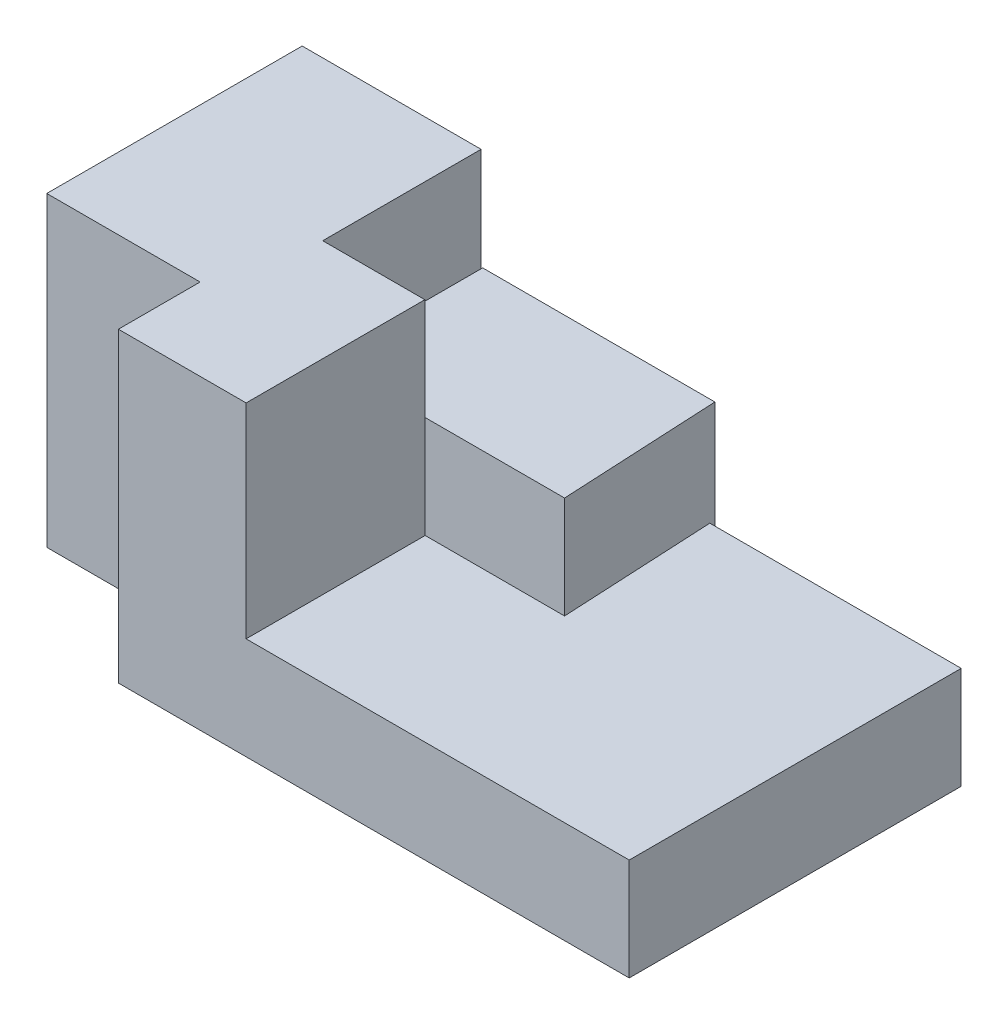
ISO-10303-21;
HEADER;
FILE_DESCRIPTION(('STEP AP214'),'2;1');
FILE_NAME('part.step','',(''),(''),'','','');
FILE_SCHEMA(('AUTOMOTIVE_DESIGN { 1 0 10303 214 1 1 1 1 }'));
ENDSEC;
DATA;
#1=APPLICATION_CONTEXT('core data for automotive mechanical design processes');
#2=APPLICATION_PROTOCOL_DEFINITION('international standard','automotive_design',2000,#1);
#3=PRODUCT_CONTEXT('',#1,'mechanical');
#4=PRODUCT('Part','Part','',(#3));
#5=PRODUCT_RELATED_PRODUCT_CATEGORY('part','',(#4));
#6=PRODUCT_DEFINITION_FORMATION('','',#4);
#7=PRODUCT_DEFINITION_CONTEXT('part definition',#1,'design');
#8=PRODUCT_DEFINITION('design','',#6,#7);
#9=PRODUCT_DEFINITION_SHAPE('','',#8);
#10=(LENGTH_UNIT() NAMED_UNIT(*) SI_UNIT(.MILLI.,.METRE.));
#11=(NAMED_UNIT(*) PLANE_ANGLE_UNIT() SI_UNIT($,.RADIAN.));
#12=(NAMED_UNIT(*) SI_UNIT($,.STERADIAN.) SOLID_ANGLE_UNIT());
#13=UNCERTAINTY_MEASURE_WITH_UNIT(LENGTH_MEASURE(1.E-05),#10,'distance_accuracy_value','');
#14=(GEOMETRIC_REPRESENTATION_CONTEXT(3) GLOBAL_UNCERTAINTY_ASSIGNED_CONTEXT((#13)) GLOBAL_UNIT_ASSIGNED_CONTEXT((#10,
#11,#12)) REPRESENTATION_CONTEXT('',''));
#15=CARTESIAN_POINT('',(0.,0.,0.));
#16=DIRECTION('',(0.,0.,1.));
#17=DIRECTION('',(1.,0.,0.));
#18=AXIS2_PLACEMENT_3D('',#15,#16,#17);
#19=CARTESIAN_POINT('',(-158.75,0.,0.));
#20=DIRECTION('',(-1.,0.,0.));
#21=DIRECTION('',(0.,0.,1.));
#22=AXIS2_PLACEMENT_3D('',#19,#20,#21);
#23=PLANE('',#22);
#24=DIRECTION('',(0.,0.,-1.));
#25=VECTOR('',#24,1.);
#26=CARTESIAN_POINT('',(-158.75,152.4,82.55));
#27=LINE('',#26,#25);
#28=CARTESIAN_POINT('',(-158.75,152.4,82.55));
#29=VERTEX_POINT('',#28);
#30=CARTESIAN_POINT('',(-158.75,152.4,41.91));
#31=VERTEX_POINT('',#30);
#32=EDGE_CURVE('E241',#29,#31,#27,.T.);
#33=ORIENTED_EDGE('',*,*,#32,.T.);
#34=DIRECTION('',(0.,1.,0.));
#35=VECTOR('',#34,1.);
#36=CARTESIAN_POINT('',(-158.75,0.,41.91));
#37=LINE('',#36,#35);
#38=CARTESIAN_POINT('',(-158.75,0.,41.91));
#39=VERTEX_POINT('',#38);
#40=EDGE_CURVE('E230',#39,#31,#37,.T.);
#41=ORIENTED_EDGE('',*,*,#40,.F.);
#42=DIRECTION('',(0.,0.,1.));
#43=VECTOR('',#42,1.);
#44=CARTESIAN_POINT('',(-158.75,0.,82.55));
#45=LINE('',#44,#43);
#46=CARTESIAN_POINT('',(-158.75,0.,82.55));
#47=VERTEX_POINT('',#46);
#48=EDGE_CURVE('E244',#39,#47,#45,.T.);
#49=ORIENTED_EDGE('',*,*,#48,.T.);
#50=DIRECTION('',(0.,1.,0.));
#51=VECTOR('',#50,1.);
#52=CARTESIAN_POINT('',(-158.75,0.,82.55));
#53=LINE('',#52,#51);
#54=EDGE_CURVE('E238',#47,#29,#53,.T.);
#55=ORIENTED_EDGE('',*,*,#54,.T.);
#56=EDGE_LOOP('',(#33,#41,#49,#55));
#57=FACE_BOUND('',#56,.T.);
#58=ADVANCED_FACE('F37',(#57),#23,.T.);
#59=CARTESIAN_POINT('',(-95.25,50.8,82.55));
#60=DIRECTION('',(1.,0.,0.));
#61=DIRECTION('',(0.,0.,-1.));
#62=AXIS2_PLACEMENT_3D('',#59,#60,#61);
#63=PLANE('',#62);
#64=DIRECTION('',(0.,0.,1.));
#65=VECTOR('',#64,1.);
#66=CARTESIAN_POINT('',(-95.25,50.8,82.55));
#67=LINE('',#66,#65);
#68=CARTESIAN_POINT('',(-95.25,50.8,-6.47591955844008));
#69=VERTEX_POINT('',#68);
#70=CARTESIAN_POINT('',(-95.25,50.8,-6.34999999999999));
#71=VERTEX_POINT('',#70);
#72=EDGE_CURVE('E269',#69,#71,#67,.T.);
#73=ORIENTED_EDGE('',*,*,#72,.F.);
#74=DIRECTION('',(0.,-1.,0.));
#75=VECTOR('',#74,1.);
#76=CARTESIAN_POINT('',(-95.25,50.8,-6.47591955844008));
#77=LINE('',#76,#75);
#78=CARTESIAN_POINT('',(-95.2499999999999,7.61999999999986,-6.47591955844008));
#79=VERTEX_POINT('',#78);
#80=EDGE_CURVE('E200',#69,#79,#77,.T.);
#81=ORIENTED_EDGE('',*,*,#80,.T.);
#82=DIRECTION('',(0.,0.,-1.));
#83=VECTOR('',#82,1.);
#84=CARTESIAN_POINT('',(-95.25,7.61999999999986,82.55));
#85=LINE('',#84,#83);
#86=CARTESIAN_POINT('',(-95.25,7.61999999999986,-82.55));
#87=VERTEX_POINT('',#86);
#88=EDGE_CURVE('E203',#79,#87,#85,.T.);
#89=ORIENTED_EDGE('',*,*,#88,.T.);
#90=DIRECTION('',(0.,-1.,0.));
#91=VECTOR('',#90,1.);
#92=CARTESIAN_POINT('',(-95.25,50.8,-82.55));
#93=LINE('',#92,#91);
#94=CARTESIAN_POINT('',(-95.25,0.,-82.55));
#95=VERTEX_POINT('',#94);
#96=EDGE_CURVE('E285',#87,#95,#93,.T.);
#97=ORIENTED_EDGE('',*,*,#96,.T.);
#98=DIRECTION('',(0.,0.,1.));
#99=VECTOR('',#98,1.);
#100=CARTESIAN_POINT('',(-95.25,0.,82.55));
#101=LINE('',#100,#99);
#102=CARTESIAN_POINT('',(-95.25,0.,-6.34999999999999));
#103=VERTEX_POINT('',#102);
#104=EDGE_CURVE('E279',#95,#103,#101,.T.);
#105=ORIENTED_EDGE('',*,*,#104,.T.);
#106=DIRECTION('',(0.,-1.,0.));
#107=VECTOR('',#106,1.);
#108=CARTESIAN_POINT('',(-95.25,0.,-6.34999999999999));
#109=LINE('',#108,#107);
#110=EDGE_CURVE('E253',#71,#103,#109,.T.);
#111=ORIENTED_EDGE('',*,*,#110,.F.);
#112=EDGE_LOOP('',(#73,#81,#89,#97,#105,#111));
#113=FACE_BOUND('',#112,.T.);
#114=ADVANCED_FACE('F299',(#113),#63,.F.);
#115=CARTESIAN_POINT('',(95.25,50.8,82.55));
#116=DIRECTION('',(-1.,0.,0.));
#117=DIRECTION('',(0.,0.,1.));
#118=AXIS2_PLACEMENT_3D('',#115,#116,#117);
#119=PLANE('',#118);
#120=DIRECTION('',(0.,0.,-1.));
#121=VECTOR('',#120,1.);
#122=CARTESIAN_POINT('',(95.25,0.,82.55));
#123=LINE('',#122,#121);
#124=CARTESIAN_POINT('',(95.25,0.,82.55));
#125=VERTEX_POINT('',#124);
#126=CARTESIAN_POINT('',(95.25,0.,-82.55));
#127=VERTEX_POINT('',#126);
#128=EDGE_CURVE('E260',#125,#127,#123,.T.);
#129=ORIENTED_EDGE('',*,*,#128,.T.);
#130=DIRECTION('',(0.,-1.,0.));
#131=VECTOR('',#130,1.);
#132=CARTESIAN_POINT('',(95.25,50.8,-82.55));
#133=LINE('',#132,#131);
#134=CARTESIAN_POINT('',(95.25,50.8,-82.55));
#135=VERTEX_POINT('',#134);
#136=EDGE_CURVE('E287',#135,#127,#133,.T.);
#137=ORIENTED_EDGE('',*,*,#136,.F.);
#138=DIRECTION('',(0.,0.,-1.));
#139=VECTOR('',#138,1.);
#140=CARTESIAN_POINT('',(95.25,50.8,82.55));
#141=LINE('',#140,#139);
#142=CARTESIAN_POINT('',(95.25,50.8,82.55));
#143=VERTEX_POINT('',#142);
#144=EDGE_CURVE('E261',#143,#135,#141,.T.);
#145=ORIENTED_EDGE('',*,*,#144,.F.);
#146=DIRECTION('',(0.,-1.,0.));
#147=VECTOR('',#146,1.);
#148=CARTESIAN_POINT('',(95.25,50.8,82.55));
#149=LINE('',#148,#147);
#150=EDGE_CURVE('E273',#143,#125,#149,.T.);
#151=ORIENTED_EDGE('',*,*,#150,.T.);
#152=EDGE_LOOP('',(#129,#137,#145,#151));
#153=FACE_BOUND('',#152,.T.);
#154=ADVANCED_FACE('F39',(#153),#119,.F.);
#155=CARTESIAN_POINT('',(-95.25,50.8,-82.55));
#156=DIRECTION('',(0.,0.,1.));
#157=DIRECTION('',(1.,0.,0.));
#158=AXIS2_PLACEMENT_3D('',#155,#156,#157);
#159=PLANE('',#158);
#160=DIRECTION('',(1.,0.,0.));
#161=VECTOR('',#160,1.);
#162=CARTESIAN_POINT('',(-95.25,7.61999999999986,-82.55));
#163=LINE('',#162,#161);
#164=CARTESIAN_POINT('',(-29.7738976566744,7.61999999999986,-82.55));
#165=VERTEX_POINT('',#164);
#166=EDGE_CURVE('E11',#87,#165,#163,.T.);
#167=ORIENTED_EDGE('',*,*,#166,.T.);
#168=DIRECTION('',(0.,1.,0.));
#169=VECTOR('',#168,1.);
#170=CARTESIAN_POINT('',(-29.7738976566744,50.8,-82.55));
#171=LINE('',#170,#169);
#172=CARTESIAN_POINT('',(-29.7738976566744,50.8,-82.55));
#173=VERTEX_POINT('',#172);
#174=EDGE_CURVE('E163',#165,#173,#171,.T.);
#175=ORIENTED_EDGE('',*,*,#174,.T.);
#176=DIRECTION('',(-1.,0.,0.));
#177=VECTOR('',#176,1.);
#178=CARTESIAN_POINT('',(-95.25,50.8,-82.55));
#179=LINE('',#178,#177);
#180=EDGE_CURVE('E264',#135,#173,#179,.T.);
#181=ORIENTED_EDGE('',*,*,#180,.F.);
#182=ORIENTED_EDGE('',*,*,#136,.T.);
#183=DIRECTION('',(-1.,0.,0.));
#184=VECTOR('',#183,1.);
#185=CARTESIAN_POINT('',(-95.25,0.,-82.55));
#186=LINE('',#185,#184);
#187=EDGE_CURVE('E276',#127,#95,#186,.T.);
#188=ORIENTED_EDGE('',*,*,#187,.T.);
#189=ORIENTED_EDGE('',*,*,#96,.F.);
#190=EDGE_LOOP('',(#167,#175,#181,#182,#188,#189));
#191=FACE_BOUND('',#190,.T.);
#192=ADVANCED_FACE('F324',(#191),#159,.F.);
#193=CARTESIAN_POINT('',(-95.25,50.8,82.55));
#194=DIRECTION('',(0.,0.,-1.));
#195=DIRECTION('',(-1.,0.,0.));
#196=AXIS2_PLACEMENT_3D('',#193,#194,#195);
#197=PLANE('',#196);
#198=DIRECTION('',(1.,0.,0.));
#199=VECTOR('',#198,1.);
#200=CARTESIAN_POINT('',(-95.25,0.,82.55));
#201=LINE('',#200,#199);
#202=EDGE_CURVE('E265',#47,#125,#201,.T.);
#203=ORIENTED_EDGE('',*,*,#202,.T.);
#204=ORIENTED_EDGE('',*,*,#150,.F.);
#205=DIRECTION('',(1.,0.,0.));
#206=VECTOR('',#205,1.);
#207=CARTESIAN_POINT('',(-95.25,50.8,82.55));
#208=LINE('',#207,#206);
#209=CARTESIAN_POINT('',(-95.25,50.8,82.55));
#210=VERTEX_POINT('',#209);
#211=EDGE_CURVE('E271',#210,#143,#208,.T.);
#212=ORIENTED_EDGE('',*,*,#211,.F.);
#213=DIRECTION('',(0.,1.,0.));
#214=VECTOR('',#213,1.);
#215=CARTESIAN_POINT('',(-95.25,0.,82.55));
#216=LINE('',#215,#214);
#217=CARTESIAN_POINT('',(-95.25,152.4,82.55));
#218=VERTEX_POINT('',#217);
#219=EDGE_CURVE('E228',#210,#218,#216,.T.);
#220=ORIENTED_EDGE('',*,*,#219,.T.);
#221=DIRECTION('',(1.,0.,0.));
#222=VECTOR('',#221,1.);
#223=CARTESIAN_POINT('',(-158.75,152.4,82.55));
#224=LINE('',#223,#222);
#225=EDGE_CURVE('E257',#29,#218,#224,.T.);
#226=ORIENTED_EDGE('',*,*,#225,.F.);
#227=ORIENTED_EDGE('',*,*,#54,.F.);
#228=EDGE_LOOP('',(#203,#204,#212,#220,#226,#227));
#229=FACE_BOUND('',#228,.T.);
#230=ADVANCED_FACE('F317',(#229),#197,.F.);
#231=CARTESIAN_POINT('',(0.,50.8,0.));
#232=DIRECTION('',(0.,-1.,0.));
#233=DIRECTION('',(0.,0.,-1.));
#234=AXIS2_PLACEMENT_3D('',#231,#232,#233);
#235=PLANE('',#234);
#236=DIRECTION('',(0.0505877677037833,0.,0.998719619191867));
#237=VECTOR('',#236,1.);
#238=CARTESIAN_POINT('',(-25.5270292851742,50.8,1.29301097408199));
#239=LINE('',#238,#237);
#240=CARTESIAN_POINT('',(-25.9205459894962,50.8,-6.47591955844008));
#241=VERTEX_POINT('',#240);
#242=EDGE_CURVE('E290',#173,#241,#239,.T.);
#243=ORIENTED_EDGE('',*,*,#242,.T.);
#244=DIRECTION('',(-1.,0.,0.));
#245=VECTOR('',#244,1.);
#246=CARTESIAN_POINT('',(0.,50.8,-6.47591955844008));
#247=LINE('',#246,#245);
#248=EDGE_CURVE('E45',#241,#69,#247,.T.);
#249=ORIENTED_EDGE('',*,*,#248,.T.);
#250=ORIENTED_EDGE('',*,*,#72,.T.);
#251=EDGE_CURVE('E268',#71,#210,#67,.T.);
#252=ORIENTED_EDGE('',*,*,#251,.T.);
#253=ORIENTED_EDGE('',*,*,#211,.T.);
#254=ORIENTED_EDGE('',*,*,#144,.T.);
#255=ORIENTED_EDGE('',*,*,#180,.T.);
#256=EDGE_LOOP('',(#243,#249,#250,#252,#253,#254,#255));
#257=FACE_BOUND('',#256,.T.);
#258=ADVANCED_FACE('F295',(#257),#235,.F.);
#259=CARTESIAN_POINT('',(0.,0.,0.));
#260=DIRECTION('',(0.,-1.,0.));
#261=DIRECTION('',(0.,0.,-1.));
#262=AXIS2_PLACEMENT_3D('',#259,#260,#261);
#263=PLANE('',#262);
#264=DIRECTION('',(0.,0.,-1.));
#265=VECTOR('',#264,1.);
#266=CARTESIAN_POINT('',(-146.05,0.,0.));
#267=LINE('',#266,#265);
#268=CARTESIAN_POINT('',(-146.05,0.,-6.34999999999999));
#269=VERTEX_POINT('',#268);
#270=CARTESIAN_POINT('',(-146.05,0.,-85.09));
#271=VERTEX_POINT('',#270);
#272=EDGE_CURVE('E214',#269,#271,#267,.T.);
#273=ORIENTED_EDGE('',*,*,#272,.F.);
#274=DIRECTION('',(1.,0.,0.));
#275=VECTOR('',#274,1.);
#276=CARTESIAN_POINT('',(-158.75,0.,-6.34999999999999));
#277=LINE('',#276,#275);
#278=EDGE_CURVE('E246',#269,#103,#277,.T.);
#279=ORIENTED_EDGE('',*,*,#278,.T.);
#280=ORIENTED_EDGE('',*,*,#104,.F.);
#281=ORIENTED_EDGE('',*,*,#187,.F.);
#282=ORIENTED_EDGE('',*,*,#128,.F.);
#283=ORIENTED_EDGE('',*,*,#202,.F.);
#284=ORIENTED_EDGE('',*,*,#48,.F.);
#285=DIRECTION('',(-1.,0.,0.));
#286=VECTOR('',#285,1.);
#287=CARTESIAN_POINT('',(0.,0.,41.91));
#288=LINE('',#287,#286);
#289=CARTESIAN_POINT('',(-235.014810015443,0.,41.91));
#290=VERTEX_POINT('',#289);
#291=EDGE_CURVE('E212',#39,#290,#288,.T.);
#292=ORIENTED_EDGE('',*,*,#291,.T.);
#293=DIRECTION('',(0.,0.,-1.));
#294=VECTOR('',#293,1.);
#295=CARTESIAN_POINT('',(-235.014810015443,0.,0.));
#296=LINE('',#295,#294);
#297=CARTESIAN_POINT('',(-235.014810015443,0.,-85.09));
#298=VERTEX_POINT('',#297);
#299=EDGE_CURVE('E209',#290,#298,#296,.T.);
#300=ORIENTED_EDGE('',*,*,#299,.T.);
#301=DIRECTION('',(1.,0.,0.));
#302=VECTOR('',#301,1.);
#303=CARTESIAN_POINT('',(0.,0.,-85.09));
#304=LINE('',#303,#302);
#305=EDGE_CURVE('E207',#298,#271,#304,.T.);
#306=ORIENTED_EDGE('',*,*,#305,.T.);
#307=EDGE_LOOP('',(#273,#279,#280,#281,#282,#283,#284,#292,#300,#306));
#308=FACE_BOUND('',#307,.T.);
#309=ADVANCED_FACE('F359',(#308),#263,.T.);
#310=CARTESIAN_POINT('',(-158.75,152.4,82.55));
#311=DIRECTION('',(0.,-1.,0.));
#312=DIRECTION('',(0.,0.,-1.));
#313=AXIS2_PLACEMENT_3D('',#310,#311,#312);
#314=PLANE('',#313);
#315=DIRECTION('',(1.,0.,0.));
#316=VECTOR('',#315,1.);
#317=CARTESIAN_POINT('',(-158.75,152.4,-6.34999999999999));
#318=LINE('',#317,#316);
#319=CARTESIAN_POINT('',(-146.05,152.4,-6.34999999999999));
#320=VERTEX_POINT('',#319);
#321=CARTESIAN_POINT('',(-95.25,152.4,-6.34999999999999));
#322=VERTEX_POINT('',#321);
#323=EDGE_CURVE('E255',#320,#322,#318,.T.);
#324=ORIENTED_EDGE('',*,*,#323,.F.);
#325=DIRECTION('',(0.,0.,-1.));
#326=VECTOR('',#325,1.);
#327=CARTESIAN_POINT('',(-146.05,152.4,0.));
#328=LINE('',#327,#326);
#329=CARTESIAN_POINT('',(-146.05,152.4,-85.09));
#330=VERTEX_POINT('',#329);
#331=EDGE_CURVE('E210',#320,#330,#328,.T.);
#332=ORIENTED_EDGE('',*,*,#331,.T.);
#333=DIRECTION('',(1.,0.,0.));
#334=VECTOR('',#333,1.);
#335=CARTESIAN_POINT('',(0.,152.4,-85.09));
#336=LINE('',#335,#334);
#337=CARTESIAN_POINT('',(-235.014810015443,152.4,-85.09));
#338=VERTEX_POINT('',#337);
#339=EDGE_CURVE('E206',#338,#330,#336,.T.);
#340=ORIENTED_EDGE('',*,*,#339,.F.);
#341=DIRECTION('',(0.,0.,-1.));
#342=VECTOR('',#341,1.);
#343=CARTESIAN_POINT('',(-235.014810015443,152.4,0.));
#344=LINE('',#343,#342);
#345=CARTESIAN_POINT('',(-235.014810015443,152.4,41.91));
#346=VERTEX_POINT('',#345);
#347=EDGE_CURVE('E220',#346,#338,#344,.T.);
#348=ORIENTED_EDGE('',*,*,#347,.F.);
#349=DIRECTION('',(-1.,0.,0.));
#350=VECTOR('',#349,1.);
#351=CARTESIAN_POINT('',(0.,152.4,41.91));
#352=LINE('',#351,#350);
#353=EDGE_CURVE('E222',#31,#346,#352,.T.);
#354=ORIENTED_EDGE('',*,*,#353,.F.);
#355=ORIENTED_EDGE('',*,*,#32,.F.);
#356=ORIENTED_EDGE('',*,*,#225,.T.);
#357=DIRECTION('',(0.,0.,-1.));
#358=VECTOR('',#357,1.);
#359=CARTESIAN_POINT('',(-95.25,152.4,82.55));
#360=LINE('',#359,#358);
#361=EDGE_CURVE('E248',#218,#322,#360,.T.);
#362=ORIENTED_EDGE('',*,*,#361,.T.);
#363=EDGE_LOOP('',(#324,#332,#340,#348,#354,#355,#356,#362));
#364=FACE_BOUND('',#363,.T.);
#365=ADVANCED_FACE('F312',(#364),#314,.F.);
#366=CARTESIAN_POINT('',(-158.75,0.,-6.34999999999999));
#367=DIRECTION('',(0.,0.,1.));
#368=DIRECTION('',(0.,-1.,0.));
#369=AXIS2_PLACEMENT_3D('',#366,#367,#368);
#370=PLANE('',#369);
#371=ORIENTED_EDGE('',*,*,#278,.F.);
#372=DIRECTION('',(0.,1.,0.));
#373=VECTOR('',#372,1.);
#374=CARTESIAN_POINT('',(-146.05,0.,-6.34999999999999));
#375=LINE('',#374,#373);
#376=EDGE_CURVE('E60',#269,#320,#375,.T.);
#377=ORIENTED_EDGE('',*,*,#376,.T.);
#378=ORIENTED_EDGE('',*,*,#323,.T.);
#379=EDGE_CURVE('E242',#322,#71,#109,.T.);
#380=ORIENTED_EDGE('',*,*,#379,.T.);
#381=ORIENTED_EDGE('',*,*,#110,.T.);
#382=EDGE_LOOP('',(#371,#377,#378,#380,#381));
#383=FACE_BOUND('',#382,.T.);
#384=ADVANCED_FACE('F309',(#383),#370,.F.);
#385=CARTESIAN_POINT('',(-95.25,0.,0.));
#386=DIRECTION('',(-1.,0.,0.));
#387=DIRECTION('',(0.,0.,1.));
#388=AXIS2_PLACEMENT_3D('',#385,#386,#387);
#389=PLANE('',#388);
#390=ORIENTED_EDGE('',*,*,#251,.F.);
#391=ORIENTED_EDGE('',*,*,#379,.F.);
#392=ORIENTED_EDGE('',*,*,#361,.F.);
#393=ORIENTED_EDGE('',*,*,#219,.F.);
#394=EDGE_LOOP('',(#390,#391,#392,#393));
#395=FACE_BOUND('',#394,.T.);
#396=ADVANCED_FACE('F306',(#395),#389,.F.);
#397=CARTESIAN_POINT('',(0.,0.,-85.09));
#398=DIRECTION('',(0.,0.,1.));
#399=DIRECTION('',(1.,0.,0.));
#400=AXIS2_PLACEMENT_3D('',#397,#398,#399);
#401=PLANE('',#400);
#402=ORIENTED_EDGE('',*,*,#339,.T.);
#403=DIRECTION('',(0.,1.,0.));
#404=VECTOR('',#403,1.);
#405=CARTESIAN_POINT('',(-146.05,0.,-85.09));
#406=LINE('',#405,#404);
#407=EDGE_CURVE('E226',#271,#330,#406,.T.);
#408=ORIENTED_EDGE('',*,*,#407,.F.);
#409=ORIENTED_EDGE('',*,*,#305,.F.);
#410=DIRECTION('',(0.,1.,0.));
#411=VECTOR('',#410,1.);
#412=CARTESIAN_POINT('',(-235.014810015443,0.,-85.09));
#413=LINE('',#412,#411);
#414=EDGE_CURVE('E217',#298,#338,#413,.T.);
#415=ORIENTED_EDGE('',*,*,#414,.T.);
#416=EDGE_LOOP('',(#402,#408,#409,#415));
#417=FACE_BOUND('',#416,.T.);
#418=ADVANCED_FACE('F351',(#417),#401,.F.);
#419=CARTESIAN_POINT('',(-146.05,0.,0.));
#420=DIRECTION('',(1.,0.,0.));
#421=DIRECTION('',(0.,0.,-1.));
#422=AXIS2_PLACEMENT_3D('',#419,#420,#421);
#423=PLANE('',#422);
#424=ORIENTED_EDGE('',*,*,#331,.F.);
#425=ORIENTED_EDGE('',*,*,#376,.F.);
#426=ORIENTED_EDGE('',*,*,#272,.T.);
#427=ORIENTED_EDGE('',*,*,#407,.T.);
#428=EDGE_LOOP('',(#424,#425,#426,#427));
#429=FACE_BOUND('',#428,.T.);
#430=ADVANCED_FACE('F441',(#429),#423,.T.);
#431=CARTESIAN_POINT('',(0.,0.,41.91));
#432=DIRECTION('',(0.,0.,-1.));
#433=DIRECTION('',(-1.,0.,0.));
#434=AXIS2_PLACEMENT_3D('',#431,#432,#433);
#435=PLANE('',#434);
#436=ORIENTED_EDGE('',*,*,#353,.T.);
#437=DIRECTION('',(0.,1.,0.));
#438=VECTOR('',#437,1.);
#439=CARTESIAN_POINT('',(-235.014810015443,0.,41.91));
#440=LINE('',#439,#438);
#441=EDGE_CURVE('E233',#290,#346,#440,.T.);
#442=ORIENTED_EDGE('',*,*,#441,.F.);
#443=ORIENTED_EDGE('',*,*,#291,.F.);
#444=ORIENTED_EDGE('',*,*,#40,.T.);
#445=EDGE_LOOP('',(#436,#442,#443,#444));
#446=FACE_BOUND('',#445,.T.);
#447=ADVANCED_FACE('F444',(#446),#435,.F.);
#448=CARTESIAN_POINT('',(-235.014810015443,0.,0.));
#449=DIRECTION('',(1.,0.,0.));
#450=DIRECTION('',(0.,0.,-1.));
#451=AXIS2_PLACEMENT_3D('',#448,#449,#450);
#452=PLANE('',#451);
#453=ORIENTED_EDGE('',*,*,#347,.T.);
#454=ORIENTED_EDGE('',*,*,#414,.F.);
#455=ORIENTED_EDGE('',*,*,#299,.F.);
#456=ORIENTED_EDGE('',*,*,#441,.T.);
#457=EDGE_LOOP('',(#453,#454,#455,#456));
#458=FACE_BOUND('',#457,.T.);
#459=ADVANCED_FACE('F384',(#458),#452,.F.);
#460=CARTESIAN_POINT('',(0.,7.61999999999986,0.));
#461=DIRECTION('',(0.,-1.,0.));
#462=DIRECTION('',(0.,0.,-1.));
#463=AXIS2_PLACEMENT_3D('',#460,#461,#462);
#464=PLANE('',#463);
#465=ORIENTED_EDGE('',*,*,#88,.F.);
#466=DIRECTION('',(1.,0.,0.));
#467=VECTOR('',#466,1.);
#468=CARTESIAN_POINT('',(-25.9205459894962,7.61999999999986,-6.47591955844008));
#469=LINE('',#468,#467);
#470=CARTESIAN_POINT('',(-145.392235631221,7.61999999999986,-6.47591955844008));
#471=VERTEX_POINT('',#470);
#472=EDGE_CURVE('E167',#471,#79,#469,.T.);
#473=ORIENTED_EDGE('',*,*,#472,.F.);
#474=DIRECTION('',(0.,0.,1.));
#475=VECTOR('',#474,1.);
#476=CARTESIAN_POINT('',(-145.392235631221,7.61999999999986,-6.47591955844008));
#477=LINE('',#476,#475);
#478=CARTESIAN_POINT('',(-145.392235631221,7.61999999999986,-85.2170249737974));
#479=VERTEX_POINT('',#478);
#480=EDGE_CURVE('E181',#479,#471,#477,.T.);
#481=ORIENTED_EDGE('',*,*,#480,.F.);
#482=DIRECTION('',(-1.,0.,0.));
#483=VECTOR('',#482,1.);
#484=CARTESIAN_POINT('',(-145.392235631221,7.61999999999986,-85.2170249737974));
#485=LINE('',#484,#483);
#486=CARTESIAN_POINT('',(-29.9089894654683,7.61999999999986,-85.2170249737974));
#487=VERTEX_POINT('',#486);
#488=EDGE_CURVE('E166',#487,#479,#485,.T.);
#489=ORIENTED_EDGE('',*,*,#488,.F.);
#490=DIRECTION('',(-0.0505877677037833,0.,-0.998719619191867));
#491=VECTOR('',#490,1.);
#492=CARTESIAN_POINT('',(-29.9089894654683,7.61999999999986,-85.2170249737974));
#493=LINE('',#492,#491);
#494=EDGE_CURVE('E157',#165,#487,#493,.T.);
#495=ORIENTED_EDGE('',*,*,#494,.F.);
#496=ORIENTED_EDGE('',*,*,#166,.F.);
#497=EDGE_LOOP('',(#465,#473,#481,#489,#495,#496));
#498=FACE_BOUND('',#497,.T.);
#499=ADVANCED_FACE('F178',(#498),#464,.T.);
#500=CARTESIAN_POINT('',(-25.9205459894962,7.61999999999986,-6.47591955844008));
#501=DIRECTION('',(0.,0.,1.));
#502=DIRECTION('',(1.,0.,0.));
#503=AXIS2_PLACEMENT_3D('',#500,#501,#502);
#504=PLANE('',#503);
#505=ORIENTED_EDGE('',*,*,#80,.F.);
#506=ORIENTED_EDGE('',*,*,#248,.F.);
#507=DIRECTION('',(0.,1.,0.));
#508=VECTOR('',#507,1.);
#509=CARTESIAN_POINT('',(-25.9205459894962,7.61999999999986,-6.47591955844008));
#510=LINE('',#509,#508);
#511=CARTESIAN_POINT('',(-25.9205459894962,101.6,-6.47591955844008));
#512=VERTEX_POINT('',#511);
#513=EDGE_CURVE('E52',#241,#512,#510,.T.);
#514=ORIENTED_EDGE('',*,*,#513,.T.);
#515=DIRECTION('',(1.,0.,0.));
#516=VECTOR('',#515,1.);
#517=CARTESIAN_POINT('',(-25.9205459894962,101.6,-6.47591955844008));
#518=LINE('',#517,#516);
#519=CARTESIAN_POINT('',(-145.392235631221,101.6,-6.47591955844008));
#520=VERTEX_POINT('',#519);
#521=EDGE_CURVE('E186',#520,#512,#518,.T.);
#522=ORIENTED_EDGE('',*,*,#521,.F.);
#523=DIRECTION('',(0.,1.,0.));
#524=VECTOR('',#523,1.);
#525=CARTESIAN_POINT('',(-145.392235631221,7.61999999999986,-6.47591955844008));
#526=LINE('',#525,#524);
#527=EDGE_CURVE('E195',#471,#520,#526,.T.);
#528=ORIENTED_EDGE('',*,*,#527,.F.);
#529=ORIENTED_EDGE('',*,*,#472,.T.);
#530=EDGE_LOOP('',(#505,#506,#514,#522,#528,#529));
#531=FACE_BOUND('',#530,.T.);
#532=ADVANCED_FACE('F327',(#531),#504,.T.);
#533=CARTESIAN_POINT('',(-29.9089894654683,7.61999999999986,-85.2170249737974));
#534=DIRECTION('',(0.998719619191867,0.,-0.0505877677037833));
#535=DIRECTION('',(-0.0505877677037833,0.,-0.998719619191867));
#536=AXIS2_PLACEMENT_3D('',#533,#534,#535);
#537=PLANE('',#536);
#538=ORIENTED_EDGE('',*,*,#174,.F.);
#539=ORIENTED_EDGE('',*,*,#494,.T.);
#540=DIRECTION('',(0.,1.,0.));
#541=VECTOR('',#540,1.);
#542=CARTESIAN_POINT('',(-29.9089894654683,7.61999999999986,-85.2170249737974));
#543=LINE('',#542,#541);
#544=CARTESIAN_POINT('',(-29.9089894654683,101.6,-85.2170249737974));
#545=VERTEX_POINT('',#544);
#546=EDGE_CURVE('E160',#487,#545,#543,.T.);
#547=ORIENTED_EDGE('',*,*,#546,.T.);
#548=DIRECTION('',(-0.0505877677037833,0.,-0.998719619191867));
#549=VECTOR('',#548,1.);
#550=CARTESIAN_POINT('',(-29.9089894654683,101.6,-85.2170249737974));
#551=LINE('',#550,#549);
#552=EDGE_CURVE('E189',#512,#545,#551,.T.);
#553=ORIENTED_EDGE('',*,*,#552,.F.);
#554=ORIENTED_EDGE('',*,*,#513,.F.);
#555=ORIENTED_EDGE('',*,*,#242,.F.);
#556=EDGE_LOOP('',(#538,#539,#547,#553,#554,#555));
#557=FACE_BOUND('',#556,.T.);
#558=ADVANCED_FACE('F159',(#557),#537,.T.);
#559=CARTESIAN_POINT('',(-145.392235631221,7.61999999999986,-6.47591955844008));
#560=DIRECTION('',(-1.,0.,0.));
#561=DIRECTION('',(0.,0.,1.));
#562=AXIS2_PLACEMENT_3D('',#559,#560,#561);
#563=PLANE('',#562);
#564=DIRECTION('',(0.,0.,1.));
#565=VECTOR('',#564,1.);
#566=CARTESIAN_POINT('',(-145.392235631221,101.6,-6.47591955844008));
#567=LINE('',#566,#565);
#568=CARTESIAN_POINT('',(-145.392235631221,101.6,-85.2170249737974));
#569=VERTEX_POINT('',#568);
#570=EDGE_CURVE('E192',#569,#520,#567,.T.);
#571=ORIENTED_EDGE('',*,*,#570,.F.);
#572=DIRECTION('',(0.,1.,0.));
#573=VECTOR('',#572,1.);
#574=CARTESIAN_POINT('',(-145.392235631221,7.61999999999986,-85.2170249737974));
#575=LINE('',#574,#573);
#576=EDGE_CURVE('E176',#479,#569,#575,.T.);
#577=ORIENTED_EDGE('',*,*,#576,.F.);
#578=ORIENTED_EDGE('',*,*,#480,.T.);
#579=ORIENTED_EDGE('',*,*,#527,.T.);
#580=EDGE_LOOP('',(#571,#577,#578,#579));
#581=FACE_BOUND('',#580,.T.);
#582=ADVANCED_FACE('F331',(#581),#563,.T.);
#583=CARTESIAN_POINT('',(-145.392235631221,7.61999999999986,-85.2170249737974));
#584=DIRECTION('',(0.,0.,-1.));
#585=DIRECTION('',(-1.,0.,0.));
#586=AXIS2_PLACEMENT_3D('',#583,#584,#585);
#587=PLANE('',#586);
#588=DIRECTION('',(-1.,0.,0.));
#589=VECTOR('',#588,1.);
#590=CARTESIAN_POINT('',(-145.392235631221,101.6,-85.2170249737974));
#591=LINE('',#590,#589);
#592=EDGE_CURVE('E174',#545,#569,#591,.T.);
#593=ORIENTED_EDGE('',*,*,#592,.F.);
#594=ORIENTED_EDGE('',*,*,#546,.F.);
#595=ORIENTED_EDGE('',*,*,#488,.T.);
#596=ORIENTED_EDGE('',*,*,#576,.T.);
#597=EDGE_LOOP('',(#593,#594,#595,#596));
#598=FACE_BOUND('',#597,.T.);
#599=ADVANCED_FACE('F171',(#598),#587,.T.);
#600=CARTESIAN_POINT('',(0.,101.6,0.));
#601=DIRECTION('',(0.,-1.,0.));
#602=DIRECTION('',(0.,0.,-1.));
#603=AXIS2_PLACEMENT_3D('',#600,#601,#602);
#604=PLANE('',#603);
#605=ORIENTED_EDGE('',*,*,#521,.T.);
#606=ORIENTED_EDGE('',*,*,#552,.T.);
#607=ORIENTED_EDGE('',*,*,#592,.T.);
#608=ORIENTED_EDGE('',*,*,#570,.T.);
#609=EDGE_LOOP('',(#605,#606,#607,#608));
#610=FACE_BOUND('',#609,.T.);
#611=ADVANCED_FACE('F333',(#610),#604,.F.);
#612=CLOSED_SHELL('',(#58,#114,#154,#192,#230,#258,#309,#365,#384,#396,#418,#430,#447,#459,#499,
#532,#558,#582,#599,#611));
#613=MANIFOLD_SOLID_BREP('B2',#612);
#614=ADVANCED_BREP_SHAPE_REPRESENTATION('',(#18,#613),#14);
#615=SHAPE_DEFINITION_REPRESENTATION(#9,#614);
ENDSEC;
END-ISO-10303-21;
